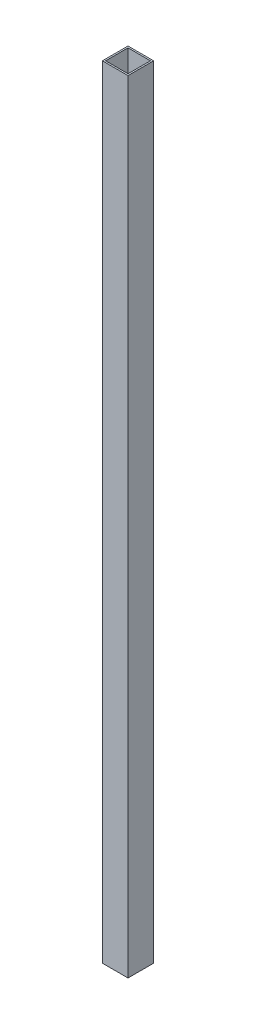
ISO-10303-21;
HEADER;
FILE_DESCRIPTION(('STEP AP214'),'2;1');
FILE_NAME('part.step','',(''),(''),'','','');
FILE_SCHEMA(('AUTOMOTIVE_DESIGN { 1 0 10303 214 1 1 1 1 }'));
ENDSEC;
DATA;
#1=APPLICATION_CONTEXT('core data for automotive mechanical design processes');
#2=APPLICATION_PROTOCOL_DEFINITION('international standard','automotive_design',2000,#1);
#3=PRODUCT_CONTEXT('',#1,'mechanical');
#4=PRODUCT('Part','Part','',(#3));
#5=PRODUCT_RELATED_PRODUCT_CATEGORY('part','',(#4));
#6=PRODUCT_DEFINITION_FORMATION('','',#4);
#7=PRODUCT_DEFINITION_CONTEXT('part definition',#1,'design');
#8=PRODUCT_DEFINITION('design','',#6,#7);
#9=PRODUCT_DEFINITION_SHAPE('','',#8);
#10=(LENGTH_UNIT() NAMED_UNIT(*) SI_UNIT(.MILLI.,.METRE.));
#11=(NAMED_UNIT(*) PLANE_ANGLE_UNIT() SI_UNIT($,.RADIAN.));
#12=(NAMED_UNIT(*) SI_UNIT($,.STERADIAN.) SOLID_ANGLE_UNIT());
#13=UNCERTAINTY_MEASURE_WITH_UNIT(LENGTH_MEASURE(1.E-05),#10,'distance_accuracy_value','');
#14=(GEOMETRIC_REPRESENTATION_CONTEXT(3) GLOBAL_UNCERTAINTY_ASSIGNED_CONTEXT((#13)) GLOBAL_UNIT_ASSIGNED_CONTEXT((#10,
#11,#12)) REPRESENTATION_CONTEXT('',''));
#15=CARTESIAN_POINT('',(0.,0.,0.));
#16=DIRECTION('',(0.,0.,1.));
#17=DIRECTION('',(1.,0.,0.));
#18=AXIS2_PLACEMENT_3D('',#15,#16,#17);
#19=CARTESIAN_POINT('',(0.,774.7,0.));
#20=DIRECTION('',(0.,-1.,0.));
#21=DIRECTION('',(0.,0.,-1.));
#22=AXIS2_PLACEMENT_3D('',#19,#20,#21);
#23=PLANE('',#22);
#24=DIRECTION('',(0.,0.,1.));
#25=VECTOR('',#24,1.);
#26=CARTESIAN_POINT('',(-12.7,774.7,-12.7));
#27=LINE('',#26,#25);
#28=CARTESIAN_POINT('',(-12.7,774.7,-12.7));
#29=VERTEX_POINT('',#28);
#30=CARTESIAN_POINT('',(-12.7,774.7,12.7));
#31=VERTEX_POINT('',#30);
#32=EDGE_CURVE('E134',#29,#31,#27,.T.);
#33=ORIENTED_EDGE('',*,*,#32,.T.);
#34=DIRECTION('',(1.,0.,0.));
#35=VECTOR('',#34,1.);
#36=CARTESIAN_POINT('',(12.7,774.7,12.7));
#37=LINE('',#36,#35);
#38=CARTESIAN_POINT('',(12.7,774.7,12.7));
#39=VERTEX_POINT('',#38);
#40=EDGE_CURVE('E137',#31,#39,#37,.T.);
#41=ORIENTED_EDGE('',*,*,#40,.T.);
#42=DIRECTION('',(0.,0.,-1.));
#43=VECTOR('',#42,1.);
#44=CARTESIAN_POINT('',(12.7,774.7,-12.7));
#45=LINE('',#44,#43);
#46=CARTESIAN_POINT('',(12.7,774.7,-12.7));
#47=VERTEX_POINT('',#46);
#48=EDGE_CURVE('E140',#39,#47,#45,.T.);
#49=ORIENTED_EDGE('',*,*,#48,.T.);
#50=DIRECTION('',(-1.,0.,0.));
#51=VECTOR('',#50,1.);
#52=CARTESIAN_POINT('',(12.7,774.7,-12.7));
#53=LINE('',#52,#51);
#54=EDGE_CURVE('E142',#47,#29,#53,.T.);
#55=ORIENTED_EDGE('',*,*,#54,.T.);
#56=EDGE_LOOP('',(#33,#41,#49,#55));
#57=FACE_BOUND('',#56,.T.);
#58=DIRECTION('',(0.,0.,1.));
#59=VECTOR('',#58,1.);
#60=CARTESIAN_POINT('',(-11.1125,774.7,-11.1125));
#61=LINE('',#60,#59);
#62=CARTESIAN_POINT('',(-11.1125,774.7,-11.1125));
#63=VERTEX_POINT('',#62);
#64=CARTESIAN_POINT('',(-11.1125,774.7,11.1125));
#65=VERTEX_POINT('',#64);
#66=EDGE_CURVE('E98',#63,#65,#61,.T.);
#67=ORIENTED_EDGE('',*,*,#66,.F.);
#68=DIRECTION('',(-1.,0.,0.));
#69=VECTOR('',#68,1.);
#70=CARTESIAN_POINT('',(11.1125,774.7,-11.1125));
#71=LINE('',#70,#69);
#72=CARTESIAN_POINT('',(11.1125,774.7,-11.1125));
#73=VERTEX_POINT('',#72);
#74=EDGE_CURVE('E120',#73,#63,#71,.T.);
#75=ORIENTED_EDGE('',*,*,#74,.F.);
#76=DIRECTION('',(0.,0.,-1.));
#77=VECTOR('',#76,1.);
#78=CARTESIAN_POINT('',(11.1125,774.7,-11.1125));
#79=LINE('',#78,#77);
#80=CARTESIAN_POINT('',(11.1125,774.7,11.1125));
#81=VERTEX_POINT('',#80);
#82=EDGE_CURVE('E118',#81,#73,#79,.T.);
#83=ORIENTED_EDGE('',*,*,#82,.F.);
#84=DIRECTION('',(1.,0.,0.));
#85=VECTOR('',#84,1.);
#86=CARTESIAN_POINT('',(11.1125,774.7,11.1125));
#87=LINE('',#86,#85);
#88=EDGE_CURVE('E106',#65,#81,#87,.T.);
#89=ORIENTED_EDGE('',*,*,#88,.F.);
#90=EDGE_LOOP('',(#67,#75,#83,#89));
#91=FACE_BOUND('',#90,.T.);
#92=ADVANCED_FACE('F33',(#57,#91),#23,.F.);
#93=CARTESIAN_POINT('',(0.,0.,0.));
#94=DIRECTION('',(0.,-1.,0.));
#95=DIRECTION('',(0.,0.,-1.));
#96=AXIS2_PLACEMENT_3D('',#93,#94,#95);
#97=PLANE('',#96);
#98=DIRECTION('',(0.,0.,1.));
#99=VECTOR('',#98,1.);
#100=CARTESIAN_POINT('',(-12.7,0.,-12.7));
#101=LINE('',#100,#99);
#102=CARTESIAN_POINT('',(-12.7,0.,-12.7));
#103=VERTEX_POINT('',#102);
#104=CARTESIAN_POINT('',(-12.7,0.,12.7));
#105=VERTEX_POINT('',#104);
#106=EDGE_CURVE('E114',#103,#105,#101,.T.);
#107=ORIENTED_EDGE('',*,*,#106,.F.);
#108=DIRECTION('',(-1.,0.,0.));
#109=VECTOR('',#108,1.);
#110=CARTESIAN_POINT('',(12.7,0.,-12.7));
#111=LINE('',#110,#109);
#112=CARTESIAN_POINT('',(12.7,0.,-12.7));
#113=VERTEX_POINT('',#112);
#114=EDGE_CURVE('E138',#113,#103,#111,.T.);
#115=ORIENTED_EDGE('',*,*,#114,.F.);
#116=DIRECTION('',(0.,0.,-1.));
#117=VECTOR('',#116,1.);
#118=CARTESIAN_POINT('',(12.7,0.,-12.7));
#119=LINE('',#118,#117);
#120=CARTESIAN_POINT('',(12.7,0.,12.7));
#121=VERTEX_POINT('',#120);
#122=EDGE_CURVE('E149',#121,#113,#119,.T.);
#123=ORIENTED_EDGE('',*,*,#122,.F.);
#124=DIRECTION('',(1.,0.,0.));
#125=VECTOR('',#124,1.);
#126=CARTESIAN_POINT('',(12.7,0.,12.7));
#127=LINE('',#126,#125);
#128=EDGE_CURVE('E147',#105,#121,#127,.T.);
#129=ORIENTED_EDGE('',*,*,#128,.F.);
#130=EDGE_LOOP('',(#107,#115,#123,#129));
#131=FACE_BOUND('',#130,.T.);
#132=DIRECTION('',(-1.,0.,0.));
#133=VECTOR('',#132,1.);
#134=CARTESIAN_POINT('',(11.1125,0.,-11.1125));
#135=LINE('',#134,#133);
#136=CARTESIAN_POINT('',(11.1125,0.,-11.1125));
#137=VERTEX_POINT('',#136);
#138=CARTESIAN_POINT('',(-11.1125,0.,-11.1125));
#139=VERTEX_POINT('',#138);
#140=EDGE_CURVE('E107',#137,#139,#135,.T.);
#141=ORIENTED_EDGE('',*,*,#140,.T.);
#142=DIRECTION('',(0.,0.,1.));
#143=VECTOR('',#142,1.);
#144=CARTESIAN_POINT('',(-11.1125,0.,-11.1125));
#145=LINE('',#144,#143);
#146=CARTESIAN_POINT('',(-11.1125,0.,11.1125));
#147=VERTEX_POINT('',#146);
#148=EDGE_CURVE('E56',#139,#147,#145,.T.);
#149=ORIENTED_EDGE('',*,*,#148,.T.);
#150=DIRECTION('',(1.,0.,0.));
#151=VECTOR('',#150,1.);
#152=CARTESIAN_POINT('',(11.1125,0.,11.1125));
#153=LINE('',#152,#151);
#154=CARTESIAN_POINT('',(11.1125,0.,11.1125));
#155=VERTEX_POINT('',#154);
#156=EDGE_CURVE('E113',#147,#155,#153,.T.);
#157=ORIENTED_EDGE('',*,*,#156,.T.);
#158=DIRECTION('',(0.,0.,-1.));
#159=VECTOR('',#158,1.);
#160=CARTESIAN_POINT('',(11.1125,0.,-11.1125));
#161=LINE('',#160,#159);
#162=EDGE_CURVE('E126',#155,#137,#161,.T.);
#163=ORIENTED_EDGE('',*,*,#162,.T.);
#164=EDGE_LOOP('',(#141,#149,#157,#163));
#165=FACE_BOUND('',#164,.T.);
#166=ADVANCED_FACE('F167',(#131,#165),#97,.T.);
#167=CARTESIAN_POINT('',(-12.7,774.7,-12.7));
#168=DIRECTION('',(1.,0.,0.));
#169=DIRECTION('',(0.,0.,-1.));
#170=AXIS2_PLACEMENT_3D('',#167,#168,#169);
#171=PLANE('',#170);
#172=ORIENTED_EDGE('',*,*,#106,.T.);
#173=DIRECTION('',(0.,-1.,0.));
#174=VECTOR('',#173,1.);
#175=CARTESIAN_POINT('',(-12.7,774.7,12.7));
#176=LINE('',#175,#174);
#177=EDGE_CURVE('E11',#31,#105,#176,.T.);
#178=ORIENTED_EDGE('',*,*,#177,.F.);
#179=ORIENTED_EDGE('',*,*,#32,.F.);
#180=DIRECTION('',(0.,-1.,0.));
#181=VECTOR('',#180,1.);
#182=CARTESIAN_POINT('',(-12.7,774.7,-12.7));
#183=LINE('',#182,#181);
#184=EDGE_CURVE('E144',#29,#103,#183,.T.);
#185=ORIENTED_EDGE('',*,*,#184,.T.);
#186=EDGE_LOOP('',(#172,#178,#179,#185));
#187=FACE_BOUND('',#186,.T.);
#188=ADVANCED_FACE('F35',(#187),#171,.F.);
#189=CARTESIAN_POINT('',(12.7,774.7,12.7));
#190=DIRECTION('',(0.,0.,-1.));
#191=DIRECTION('',(-1.,0.,0.));
#192=AXIS2_PLACEMENT_3D('',#189,#190,#191);
#193=PLANE('',#192);
#194=ORIENTED_EDGE('',*,*,#128,.T.);
#195=DIRECTION('',(0.,-1.,0.));
#196=VECTOR('',#195,1.);
#197=CARTESIAN_POINT('',(12.7,774.7,12.7));
#198=LINE('',#197,#196);
#199=EDGE_CURVE('E41',#39,#121,#198,.T.);
#200=ORIENTED_EDGE('',*,*,#199,.F.);
#201=ORIENTED_EDGE('',*,*,#40,.F.);
#202=ORIENTED_EDGE('',*,*,#177,.T.);
#203=EDGE_LOOP('',(#194,#200,#201,#202));
#204=FACE_BOUND('',#203,.T.);
#205=ADVANCED_FACE('F177',(#204),#193,.F.);
#206=CARTESIAN_POINT('',(12.7,774.7,-12.7));
#207=DIRECTION('',(-1.,0.,0.));
#208=DIRECTION('',(0.,0.,1.));
#209=AXIS2_PLACEMENT_3D('',#206,#207,#208);
#210=PLANE('',#209);
#211=ORIENTED_EDGE('',*,*,#122,.T.);
#212=DIRECTION('',(0.,-1.,0.));
#213=VECTOR('',#212,1.);
#214=CARTESIAN_POINT('',(12.7,774.7,-12.7));
#215=LINE('',#214,#213);
#216=EDGE_CURVE('E154',#47,#113,#215,.T.);
#217=ORIENTED_EDGE('',*,*,#216,.F.);
#218=ORIENTED_EDGE('',*,*,#48,.F.);
#219=ORIENTED_EDGE('',*,*,#199,.T.);
#220=EDGE_LOOP('',(#211,#217,#218,#219));
#221=FACE_BOUND('',#220,.T.);
#222=ADVANCED_FACE('F161',(#221),#210,.F.);
#223=CARTESIAN_POINT('',(12.7,774.7,-12.7));
#224=DIRECTION('',(0.,0.,1.));
#225=DIRECTION('',(1.,0.,0.));
#226=AXIS2_PLACEMENT_3D('',#223,#224,#225);
#227=PLANE('',#226);
#228=ORIENTED_EDGE('',*,*,#114,.T.);
#229=ORIENTED_EDGE('',*,*,#184,.F.);
#230=ORIENTED_EDGE('',*,*,#54,.F.);
#231=ORIENTED_EDGE('',*,*,#216,.T.);
#232=EDGE_LOOP('',(#228,#229,#230,#231));
#233=FACE_BOUND('',#232,.T.);
#234=ADVANCED_FACE('F171',(#233),#227,.F.);
#235=CARTESIAN_POINT('',(-11.1125,774.7,-11.1125));
#236=DIRECTION('',(1.,0.,0.));
#237=DIRECTION('',(0.,0.,-1.));
#238=AXIS2_PLACEMENT_3D('',#235,#236,#237);
#239=PLANE('',#238);
#240=ORIENTED_EDGE('',*,*,#148,.F.);
#241=DIRECTION('',(0.,-1.,0.));
#242=VECTOR('',#241,1.);
#243=CARTESIAN_POINT('',(-11.1125,774.7,-11.1125));
#244=LINE('',#243,#242);
#245=EDGE_CURVE('E102',#63,#139,#244,.T.);
#246=ORIENTED_EDGE('',*,*,#245,.F.);
#247=ORIENTED_EDGE('',*,*,#66,.T.);
#248=DIRECTION('',(0.,-1.,0.));
#249=VECTOR('',#248,1.);
#250=CARTESIAN_POINT('',(-11.1125,774.7,11.1125));
#251=LINE('',#250,#249);
#252=EDGE_CURVE('E101',#65,#147,#251,.T.);
#253=ORIENTED_EDGE('',*,*,#252,.T.);
#254=EDGE_LOOP('',(#240,#246,#247,#253));
#255=FACE_BOUND('',#254,.T.);
#256=ADVANCED_FACE('F100',(#255),#239,.T.);
#257=CARTESIAN_POINT('',(11.1125,774.7,11.1125));
#258=DIRECTION('',(0.,0.,-1.));
#259=DIRECTION('',(-1.,0.,0.));
#260=AXIS2_PLACEMENT_3D('',#257,#258,#259);
#261=PLANE('',#260);
#262=ORIENTED_EDGE('',*,*,#156,.F.);
#263=ORIENTED_EDGE('',*,*,#252,.F.);
#264=ORIENTED_EDGE('',*,*,#88,.T.);
#265=DIRECTION('',(0.,-1.,0.));
#266=VECTOR('',#265,1.);
#267=CARTESIAN_POINT('',(11.1125,774.7,11.1125));
#268=LINE('',#267,#266);
#269=EDGE_CURVE('E115',#81,#155,#268,.T.);
#270=ORIENTED_EDGE('',*,*,#269,.T.);
#271=EDGE_LOOP('',(#262,#263,#264,#270));
#272=FACE_BOUND('',#271,.T.);
#273=ADVANCED_FACE('F110',(#272),#261,.T.);
#274=CARTESIAN_POINT('',(11.1125,774.7,-11.1125));
#275=DIRECTION('',(-1.,0.,0.));
#276=DIRECTION('',(0.,0.,1.));
#277=AXIS2_PLACEMENT_3D('',#274,#275,#276);
#278=PLANE('',#277);
#279=ORIENTED_EDGE('',*,*,#162,.F.);
#280=ORIENTED_EDGE('',*,*,#269,.F.);
#281=ORIENTED_EDGE('',*,*,#82,.T.);
#282=DIRECTION('',(0.,-1.,0.));
#283=VECTOR('',#282,1.);
#284=CARTESIAN_POINT('',(11.1125,774.7,-11.1125));
#285=LINE('',#284,#283);
#286=EDGE_CURVE('E48',#73,#137,#285,.T.);
#287=ORIENTED_EDGE('',*,*,#286,.T.);
#288=EDGE_LOOP('',(#279,#280,#281,#287));
#289=FACE_BOUND('',#288,.T.);
#290=ADVANCED_FACE('F200',(#289),#278,.T.);
#291=CARTESIAN_POINT('',(11.1125,774.7,-11.1125));
#292=DIRECTION('',(0.,0.,1.));
#293=DIRECTION('',(1.,0.,0.));
#294=AXIS2_PLACEMENT_3D('',#291,#292,#293);
#295=PLANE('',#294);
#296=ORIENTED_EDGE('',*,*,#140,.F.);
#297=ORIENTED_EDGE('',*,*,#286,.F.);
#298=ORIENTED_EDGE('',*,*,#74,.T.);
#299=ORIENTED_EDGE('',*,*,#245,.T.);
#300=EDGE_LOOP('',(#296,#297,#298,#299));
#301=FACE_BOUND('',#300,.T.);
#302=ADVANCED_FACE('F204',(#301),#295,.T.);
#303=CLOSED_SHELL('',(#92,#166,#188,#205,#222,#234,#256,#273,#290,#302));
#304=MANIFOLD_SOLID_BREP('B2',#303);
#305=ADVANCED_BREP_SHAPE_REPRESENTATION('',(#18,#304),#14);
#306=SHAPE_DEFINITION_REPRESENTATION(#9,#305);
ENDSEC;
END-ISO-10303-21;
